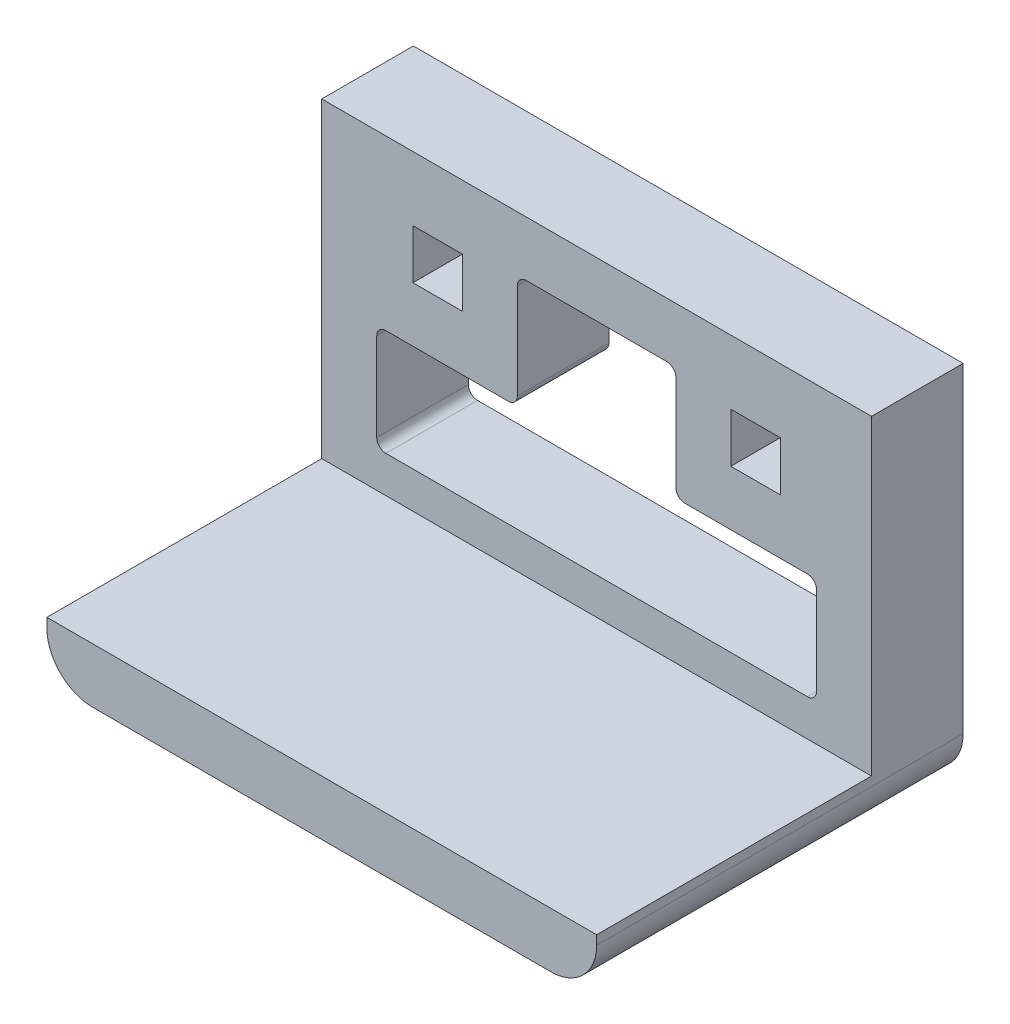
ISO-10303-21;
HEADER;
FILE_DESCRIPTION(('STEP AP214'),'2;1');
FILE_NAME('part.step','',(''),(''),'','','');
FILE_SCHEMA(('AUTOMOTIVE_DESIGN { 1 0 10303 214 1 1 1 1 }'));
ENDSEC;
DATA;
#1=APPLICATION_CONTEXT('core data for automotive mechanical design processes');
#2=APPLICATION_PROTOCOL_DEFINITION('international standard','automotive_design',2000,#1);
#3=PRODUCT_CONTEXT('',#1,'mechanical');
#4=PRODUCT('Part','Part','',(#3));
#5=PRODUCT_RELATED_PRODUCT_CATEGORY('part','',(#4));
#6=PRODUCT_DEFINITION_FORMATION('','',#4);
#7=PRODUCT_DEFINITION_CONTEXT('part definition',#1,'design');
#8=PRODUCT_DEFINITION('design','',#6,#7);
#9=PRODUCT_DEFINITION_SHAPE('','',#8);
#10=(LENGTH_UNIT() NAMED_UNIT(*) SI_UNIT(.MILLI.,.METRE.));
#11=(NAMED_UNIT(*) PLANE_ANGLE_UNIT() SI_UNIT($,.RADIAN.));
#12=(NAMED_UNIT(*) SI_UNIT($,.STERADIAN.) SOLID_ANGLE_UNIT());
#13=UNCERTAINTY_MEASURE_WITH_UNIT(LENGTH_MEASURE(1.E-05),#10,'distance_accuracy_value','');
#14=(GEOMETRIC_REPRESENTATION_CONTEXT(3) GLOBAL_UNCERTAINTY_ASSIGNED_CONTEXT((#13)) GLOBAL_UNIT_ASSIGNED_CONTEXT((#10,
#11,#12)) REPRESENTATION_CONTEXT('',''));
#15=CARTESIAN_POINT('',(0.,0.,0.));
#16=DIRECTION('',(0.,0.,1.));
#17=DIRECTION('',(1.,0.,0.));
#18=AXIS2_PLACEMENT_3D('',#15,#16,#17);
#19=CARTESIAN_POINT('',(0.,0.,10.));
#20=DIRECTION('',(0.,0.,-1.));
#21=DIRECTION('',(-1.,0.,0.));
#22=AXIS2_PLACEMENT_3D('',#19,#20,#21);
#23=PLANE('',#22);
#24=DIRECTION('',(-1.,0.,0.));
#25=VECTOR('',#24,1.);
#26=CARTESIAN_POINT('',(-24.,1.6,10.));
#27=LINE('',#26,#25);
#28=CARTESIAN_POINT('',(-9.65,1.6,10.));
#29=VERTEX_POINT('',#28);
#30=CARTESIAN_POINT('',(-23.,1.6,10.));
#31=VERTEX_POINT('',#30);
#32=EDGE_CURVE('E673',#29,#31,#27,.T.);
#33=ORIENTED_EDGE('',*,*,#32,.F.);
#34=CARTESIAN_POINT('',(-9.65,2.6,10.));
#35=DIRECTION('',(0.,0.,-1.));
#36=DIRECTION('',(-1.,0.,0.));
#37=AXIS2_PLACEMENT_3D('',#34,#35,#36);
#38=CIRCLE('',#37,1.);
#39=CARTESIAN_POINT('',(-8.65,2.6,10.));
#40=VERTEX_POINT('',#39);
#41=EDGE_CURVE('E467',#29,#40,#38,.F.);
#42=ORIENTED_EDGE('',*,*,#41,.T.);
#43=DIRECTION('',(0.,-1.,0.));
#44=VECTOR('',#43,1.);
#45=CARTESIAN_POINT('',(-8.65,14.,10.));
#46=LINE('',#45,#44);
#47=CARTESIAN_POINT('',(-8.65,13.,10.));
#48=VERTEX_POINT('',#47);
#49=EDGE_CURVE('E669',#48,#40,#46,.T.);
#50=ORIENTED_EDGE('',*,*,#49,.F.);
#51=CARTESIAN_POINT('',(-7.65,13.,10.));
#52=DIRECTION('',(0.,0.,-1.));
#53=DIRECTION('',(-1.,0.,0.));
#54=AXIS2_PLACEMENT_3D('',#51,#52,#53);
#55=CIRCLE('',#54,1.);
#56=CARTESIAN_POINT('',(-7.65,14.,10.));
#57=VERTEX_POINT('',#56);
#58=EDGE_CURVE('E506',#48,#57,#55,.T.);
#59=ORIENTED_EDGE('',*,*,#58,.T.);
#60=DIRECTION('',(-1.,0.,0.));
#61=VECTOR('',#60,1.);
#62=CARTESIAN_POINT('',(-8.65,14.,10.));
#63=LINE('',#62,#61);
#64=CARTESIAN_POINT('',(7.65,14.,10.));
#65=VERTEX_POINT('',#64);
#66=EDGE_CURVE('E665',#65,#57,#63,.T.);
#67=ORIENTED_EDGE('',*,*,#66,.F.);
#68=CARTESIAN_POINT('',(7.65,13.,10.));
#69=DIRECTION('',(0.,0.,-1.));
#70=DIRECTION('',(-1.,0.,0.));
#71=AXIS2_PLACEMENT_3D('',#68,#69,#70);
#72=CIRCLE('',#71,1.);
#73=CARTESIAN_POINT('',(8.65,13.,10.));
#74=VERTEX_POINT('',#73);
#75=EDGE_CURVE('E500',#65,#74,#72,.T.);
#76=ORIENTED_EDGE('',*,*,#75,.T.);
#77=DIRECTION('',(0.,1.,0.));
#78=VECTOR('',#77,1.);
#79=CARTESIAN_POINT('',(8.65,14.,10.));
#80=LINE('',#79,#78);
#81=CARTESIAN_POINT('',(8.65,2.6,10.));
#82=VERTEX_POINT('',#81);
#83=EDGE_CURVE('E662',#82,#74,#80,.T.);
#84=ORIENTED_EDGE('',*,*,#83,.F.);
#85=CARTESIAN_POINT('',(9.65,2.6,10.));
#86=DIRECTION('',(0.,0.,-1.));
#87=DIRECTION('',(-1.,0.,0.));
#88=AXIS2_PLACEMENT_3D('',#85,#86,#87);
#89=CIRCLE('',#88,1.);
#90=CARTESIAN_POINT('',(9.65,1.6,10.));
#91=VERTEX_POINT('',#90);
#92=EDGE_CURVE('E464',#82,#91,#89,.F.);
#93=ORIENTED_EDGE('',*,*,#92,.T.);
#94=DIRECTION('',(-1.,0.,0.));
#95=VECTOR('',#94,1.);
#96=CARTESIAN_POINT('',(8.65,1.6,10.));
#97=LINE('',#96,#95);
#98=CARTESIAN_POINT('',(23.,1.6,10.));
#99=VERTEX_POINT('',#98);
#100=EDGE_CURVE('E658',#99,#91,#97,.T.);
#101=ORIENTED_EDGE('',*,*,#100,.F.);
#102=CARTESIAN_POINT('',(23.,0.600000000000002,10.));
#103=DIRECTION('',(0.,0.,-1.));
#104=DIRECTION('',(-1.,0.,0.));
#105=AXIS2_PLACEMENT_3D('',#102,#103,#104);
#106=CIRCLE('',#105,1.);
#107=CARTESIAN_POINT('',(24.,0.600000000000003,10.));
#108=VERTEX_POINT('',#107);
#109=EDGE_CURVE('E494',#99,#108,#106,.T.);
#110=ORIENTED_EDGE('',*,*,#109,.T.);
#111=DIRECTION('',(0.,1.,0.));
#112=VECTOR('',#111,1.);
#113=CARTESIAN_POINT('',(24.,1.6,10.));
#114=LINE('',#113,#112);
#115=CARTESIAN_POINT('',(24.,-9.,10.));
#116=VERTEX_POINT('',#115);
#117=EDGE_CURVE('E654',#116,#108,#114,.T.);
#118=ORIENTED_EDGE('',*,*,#117,.F.);
#119=CARTESIAN_POINT('',(23.,-9.,10.));
#120=DIRECTION('',(0.,0.,-1.));
#121=DIRECTION('',(-1.,0.,0.));
#122=AXIS2_PLACEMENT_3D('',#119,#120,#121);
#123=CIRCLE('',#122,1.);
#124=CARTESIAN_POINT('',(23.,-10.,10.));
#125=VERTEX_POINT('',#124);
#126=EDGE_CURVE('E476',#116,#125,#123,.T.);
#127=ORIENTED_EDGE('',*,*,#126,.T.);
#128=DIRECTION('',(1.,0.,0.));
#129=VECTOR('',#128,1.);
#130=CARTESIAN_POINT('',(-24.,-10.,10.));
#131=LINE('',#130,#129);
#132=CARTESIAN_POINT('',(-23.,-10.,10.));
#133=VERTEX_POINT('',#132);
#134=EDGE_CURVE('E650',#133,#125,#131,.T.);
#135=ORIENTED_EDGE('',*,*,#134,.F.);
#136=CARTESIAN_POINT('',(-23.,-9.,10.));
#137=DIRECTION('',(0.,0.,-1.));
#138=DIRECTION('',(-1.,0.,0.));
#139=AXIS2_PLACEMENT_3D('',#136,#137,#138);
#140=CIRCLE('',#139,1.);
#141=CARTESIAN_POINT('',(-24.,-9.,10.));
#142=VERTEX_POINT('',#141);
#143=EDGE_CURVE('E482',#133,#142,#140,.T.);
#144=ORIENTED_EDGE('',*,*,#143,.T.);
#145=DIRECTION('',(0.,-1.,0.));
#146=VECTOR('',#145,1.);
#147=CARTESIAN_POINT('',(-24.,1.6,10.));
#148=LINE('',#147,#146);
#149=CARTESIAN_POINT('',(-24.,0.600000000000003,10.));
#150=VERTEX_POINT('',#149);
#151=EDGE_CURVE('E646',#150,#142,#148,.T.);
#152=ORIENTED_EDGE('',*,*,#151,.F.);
#153=CARTESIAN_POINT('',(-23.,0.600000000000002,10.));
#154=DIRECTION('',(0.,0.,-1.));
#155=DIRECTION('',(-1.,0.,0.));
#156=AXIS2_PLACEMENT_3D('',#153,#154,#155);
#157=CIRCLE('',#156,1.);
#158=EDGE_CURVE('E488',#150,#31,#157,.T.);
#159=ORIENTED_EDGE('',*,*,#158,.T.);
#160=EDGE_LOOP('',(#33,#42,#50,#59,#67,#76,#84,#93,#101,#110,#118,#127,#135,#144,#152,#159));
#161=FACE_BOUND('',#160,.T.);
#162=DIRECTION('',(-1.,0.,0.));
#163=VECTOR('',#162,1.);
#164=CARTESIAN_POINT('',(20.05,13.,10.));
#165=LINE('',#164,#163);
#166=CARTESIAN_POINT('',(20.05,13.,10.));
#167=VERTEX_POINT('',#166);
#168=CARTESIAN_POINT('',(14.65,13.,10.));
#169=VERTEX_POINT('',#168);
#170=EDGE_CURVE('E358',#167,#169,#165,.T.);
#171=ORIENTED_EDGE('',*,*,#170,.F.);
#172=DIRECTION('',(0.,1.,0.));
#173=VECTOR('',#172,1.);
#174=CARTESIAN_POINT('',(20.05,7.6,10.));
#175=LINE('',#174,#173);
#176=CARTESIAN_POINT('',(20.05,7.6,10.));
#177=VERTEX_POINT('',#176);
#178=EDGE_CURVE('E312',#177,#167,#175,.T.);
#179=ORIENTED_EDGE('',*,*,#178,.F.);
#180=DIRECTION('',(1.,0.,0.));
#181=VECTOR('',#180,1.);
#182=CARTESIAN_POINT('',(20.05,7.6,10.));
#183=LINE('',#182,#181);
#184=CARTESIAN_POINT('',(14.65,7.6,10.));
#185=VERTEX_POINT('',#184);
#186=EDGE_CURVE('E349',#185,#177,#183,.T.);
#187=ORIENTED_EDGE('',*,*,#186,.F.);
#188=DIRECTION('',(0.,-1.,0.));
#189=VECTOR('',#188,1.);
#190=CARTESIAN_POINT('',(14.65,7.6,10.));
#191=LINE('',#190,#189);
#192=EDGE_CURVE('E353',#169,#185,#191,.T.);
#193=ORIENTED_EDGE('',*,*,#192,.F.);
#194=EDGE_LOOP('',(#171,#179,#187,#193));
#195=FACE_BOUND('',#194,.T.);
#196=DIRECTION('',(-1.,0.,0.));
#197=VECTOR('',#196,1.);
#198=CARTESIAN_POINT('',(-20.05,13.,10.));
#199=LINE('',#198,#197);
#200=CARTESIAN_POINT('',(-14.65,13.,10.));
#201=VERTEX_POINT('',#200);
#202=CARTESIAN_POINT('',(-20.05,13.,10.));
#203=VERTEX_POINT('',#202);
#204=EDGE_CURVE('E311',#201,#203,#199,.T.);
#205=ORIENTED_EDGE('',*,*,#204,.F.);
#206=DIRECTION('',(0.,1.,0.));
#207=VECTOR('',#206,1.);
#208=CARTESIAN_POINT('',(-14.65,7.6,10.));
#209=LINE('',#208,#207);
#210=CARTESIAN_POINT('',(-14.65,7.6,10.));
#211=VERTEX_POINT('',#210);
#212=EDGE_CURVE('E308',#211,#201,#209,.T.);
#213=ORIENTED_EDGE('',*,*,#212,.F.);
#214=DIRECTION('',(1.,0.,0.));
#215=VECTOR('',#214,1.);
#216=CARTESIAN_POINT('',(-20.05,7.6,10.));
#217=LINE('',#216,#215);
#218=CARTESIAN_POINT('',(-20.05,7.6,10.));
#219=VERTEX_POINT('',#218);
#220=EDGE_CURVE('E295',#219,#211,#217,.T.);
#221=ORIENTED_EDGE('',*,*,#220,.F.);
#222=DIRECTION('',(0.,-1.,0.));
#223=VECTOR('',#222,1.);
#224=CARTESIAN_POINT('',(-20.05,7.6,10.));
#225=LINE('',#224,#223);
#226=EDGE_CURVE('E316',#203,#219,#225,.T.);
#227=ORIENTED_EDGE('',*,*,#226,.F.);
#228=EDGE_LOOP('',(#205,#213,#221,#227));
#229=FACE_BOUND('',#228,.T.);
#230=DIRECTION('',(-1.,0.,0.));
#231=VECTOR('',#230,1.);
#232=CARTESIAN_POINT('',(-30.,-14.,10.));
#233=LINE('',#232,#231);
#234=CARTESIAN_POINT('',(30.,-14.,10.));
#235=VERTEX_POINT('',#234);
#236=CARTESIAN_POINT('',(-30.,-14.,10.));
#237=VERTEX_POINT('',#236);
#238=EDGE_CURVE('E285',#235,#237,#233,.T.);
#239=ORIENTED_EDGE('',*,*,#238,.F.);
#240=DIRECTION('',(0.,1.,0.));
#241=VECTOR('',#240,1.);
#242=CARTESIAN_POINT('',(30.,-20.,10.));
#243=LINE('',#242,#241);
#244=CARTESIAN_POINT('',(30.,20.,10.));
#245=VERTEX_POINT('',#244);
#246=EDGE_CURVE('E270',#235,#245,#243,.T.);
#247=ORIENTED_EDGE('',*,*,#246,.T.);
#248=DIRECTION('',(-1.,0.,0.));
#249=VECTOR('',#248,1.);
#250=CARTESIAN_POINT('',(30.,20.,10.));
#251=LINE('',#250,#249);
#252=CARTESIAN_POINT('',(-30.,20.,10.));
#253=VERTEX_POINT('',#252);
#254=EDGE_CURVE('E378',#245,#253,#251,.T.);
#255=ORIENTED_EDGE('',*,*,#254,.T.);
#256=DIRECTION('',(0.,-1.,0.));
#257=VECTOR('',#256,1.);
#258=CARTESIAN_POINT('',(-30.,-20.,10.));
#259=LINE('',#258,#257);
#260=EDGE_CURVE('E382',#253,#237,#259,.T.);
#261=ORIENTED_EDGE('',*,*,#260,.T.);
#262=EDGE_LOOP('',(#239,#247,#255,#261));
#263=FACE_BOUND('',#262,.T.);
#264=ADVANCED_FACE('F44',(#161,#195,#229,#263),#23,.F.);
#265=CARTESIAN_POINT('',(30.,20.,10.));
#266=DIRECTION('',(0.,-1.,0.));
#267=DIRECTION('',(1.,0.,0.));
#268=AXIS2_PLACEMENT_3D('',#265,#266,#267);
#269=PLANE('',#268);
#270=DIRECTION('',(-1.,0.,0.));
#271=VECTOR('',#270,1.);
#272=CARTESIAN_POINT('',(30.,20.,0.));
#273=LINE('',#272,#271);
#274=CARTESIAN_POINT('',(30.,20.,0.));
#275=VERTEX_POINT('',#274);
#276=CARTESIAN_POINT('',(-30.,20.,0.));
#277=VERTEX_POINT('',#276);
#278=EDGE_CURVE('E326',#275,#277,#273,.T.);
#279=ORIENTED_EDGE('',*,*,#278,.T.);
#280=DIRECTION('',(0.,0.,-1.));
#281=VECTOR('',#280,1.);
#282=CARTESIAN_POINT('',(-30.,20.,10.));
#283=LINE('',#282,#281);
#284=EDGE_CURVE('E404',#253,#277,#283,.T.);
#285=ORIENTED_EDGE('',*,*,#284,.F.);
#286=ORIENTED_EDGE('',*,*,#254,.F.);
#287=DIRECTION('',(0.,0.,-1.));
#288=VECTOR('',#287,1.);
#289=CARTESIAN_POINT('',(30.,20.,10.));
#290=LINE('',#289,#288);
#291=EDGE_CURVE('E388',#245,#275,#290,.T.);
#292=ORIENTED_EDGE('',*,*,#291,.T.);
#293=EDGE_LOOP('',(#279,#285,#286,#292));
#294=FACE_BOUND('',#293,.T.);
#295=ADVANCED_FACE('F546',(#294),#269,.F.);
#296=CARTESIAN_POINT('',(-30.,-20.,10.));
#297=DIRECTION('',(1.,0.,0.));
#298=DIRECTION('',(0.,0.,-1.));
#299=AXIS2_PLACEMENT_3D('',#296,#297,#298);
#300=PLANE('',#299);
#301=DIRECTION('',(0.,-1.,0.));
#302=VECTOR('',#301,1.);
#303=CARTESIAN_POINT('',(-30.,-20.,0.));
#304=LINE('',#303,#302);
#305=CARTESIAN_POINT('',(-30.,-15.,0.));
#306=VERTEX_POINT('',#305);
#307=EDGE_CURVE('E392',#277,#306,#304,.T.);
#308=ORIENTED_EDGE('',*,*,#307,.T.);
#309=DIRECTION('',(0.,0.,-1.));
#310=VECTOR('',#309,1.);
#311=CARTESIAN_POINT('',(-30.,-15.,10.));
#312=LINE('',#311,#310);
#313=CARTESIAN_POINT('',(-30.,-15.,40.));
#314=VERTEX_POINT('',#313);
#315=EDGE_CURVE('E68',#306,#314,#312,.F.);
#316=ORIENTED_EDGE('',*,*,#315,.T.);
#317=DIRECTION('',(0.,-1.,0.));
#318=VECTOR('',#317,1.);
#319=CARTESIAN_POINT('',(-30.,-20.,40.));
#320=LINE('',#319,#318);
#321=CARTESIAN_POINT('',(-30.,-14.,40.));
#322=VERTEX_POINT('',#321);
#323=EDGE_CURVE('E287',#322,#314,#320,.T.);
#324=ORIENTED_EDGE('',*,*,#323,.F.);
#325=DIRECTION('',(0.,0.,-1.));
#326=VECTOR('',#325,1.);
#327=CARTESIAN_POINT('',(-30.,-14.,40.));
#328=LINE('',#327,#326);
#329=EDGE_CURVE('E275',#322,#237,#328,.T.);
#330=ORIENTED_EDGE('',*,*,#329,.T.);
#331=ORIENTED_EDGE('',*,*,#260,.F.);
#332=ORIENTED_EDGE('',*,*,#284,.T.);
#333=EDGE_LOOP('',(#308,#316,#324,#330,#331,#332));
#334=FACE_BOUND('',#333,.T.);
#335=ADVANCED_FACE('F542',(#334),#300,.F.);
#336=CARTESIAN_POINT('',(30.,-20.,10.));
#337=DIRECTION('',(0.,1.,0.));
#338=DIRECTION('',(-1.,0.,0.));
#339=AXIS2_PLACEMENT_3D('',#336,#337,#338);
#340=PLANE('',#339);
#341=DIRECTION('',(1.,0.,0.));
#342=VECTOR('',#341,1.);
#343=CARTESIAN_POINT('',(-30.,-20.,40.));
#344=LINE('',#343,#342);
#345=CARTESIAN_POINT('',(-25.,-20.,40.));
#346=VERTEX_POINT('',#345);
#347=CARTESIAN_POINT('',(25.,-20.,40.));
#348=VERTEX_POINT('',#347);
#349=EDGE_CURVE('E263',#346,#348,#344,.T.);
#350=ORIENTED_EDGE('',*,*,#349,.F.);
#351=DIRECTION('',(0.,0.,-1.));
#352=VECTOR('',#351,1.);
#353=CARTESIAN_POINT('',(-25.,-20.,10.));
#354=LINE('',#353,#352);
#355=CARTESIAN_POINT('',(-25.,-20.,0.));
#356=VERTEX_POINT('',#355);
#357=EDGE_CURVE('E515',#346,#356,#354,.T.);
#358=ORIENTED_EDGE('',*,*,#357,.T.);
#359=DIRECTION('',(1.,0.,0.));
#360=VECTOR('',#359,1.);
#361=CARTESIAN_POINT('',(30.,-20.,0.));
#362=LINE('',#361,#360);
#363=CARTESIAN_POINT('',(25.,-20.,0.));
#364=VERTEX_POINT('',#363);
#365=EDGE_CURVE('E395',#356,#364,#362,.T.);
#366=ORIENTED_EDGE('',*,*,#365,.T.);
#367=DIRECTION('',(0.,0.,-1.));
#368=VECTOR('',#367,1.);
#369=CARTESIAN_POINT('',(25.,-20.,10.));
#370=LINE('',#369,#368);
#371=EDGE_CURVE('E512',#364,#348,#370,.F.);
#372=ORIENTED_EDGE('',*,*,#371,.T.);
#373=EDGE_LOOP('',(#350,#358,#366,#372));
#374=FACE_BOUND('',#373,.T.);
#375=ADVANCED_FACE('F534',(#374),#340,.F.);
#376=CARTESIAN_POINT('',(30.,-20.,10.));
#377=DIRECTION('',(-1.,0.,0.));
#378=DIRECTION('',(0.,-1.,0.));
#379=AXIS2_PLACEMENT_3D('',#376,#377,#378);
#380=PLANE('',#379);
#381=DIRECTION('',(0.,1.,0.));
#382=VECTOR('',#381,1.);
#383=CARTESIAN_POINT('',(30.,-20.,40.));
#384=LINE('',#383,#382);
#385=CARTESIAN_POINT('',(30.,-15.,40.));
#386=VERTEX_POINT('',#385);
#387=CARTESIAN_POINT('',(30.,-14.,40.));
#388=VERTEX_POINT('',#387);
#389=EDGE_CURVE('E254',#386,#388,#384,.T.);
#390=ORIENTED_EDGE('',*,*,#389,.F.);
#391=DIRECTION('',(0.,0.,-1.));
#392=VECTOR('',#391,1.);
#393=CARTESIAN_POINT('',(30.,-15.,10.));
#394=LINE('',#393,#392);
#395=CARTESIAN_POINT('',(30.,-15.,0.));
#396=VERTEX_POINT('',#395);
#397=EDGE_CURVE('E11',#386,#396,#394,.T.);
#398=ORIENTED_EDGE('',*,*,#397,.T.);
#399=DIRECTION('',(0.,1.,0.));
#400=VECTOR('',#399,1.);
#401=CARTESIAN_POINT('',(30.,-20.,0.));
#402=LINE('',#401,#400);
#403=EDGE_CURVE('E383',#396,#275,#402,.T.);
#404=ORIENTED_EDGE('',*,*,#403,.T.);
#405=ORIENTED_EDGE('',*,*,#291,.F.);
#406=ORIENTED_EDGE('',*,*,#246,.F.);
#407=DIRECTION('',(0.,0.,-1.));
#408=VECTOR('',#407,1.);
#409=CARTESIAN_POINT('',(30.,-14.,40.));
#410=LINE('',#409,#408);
#411=EDGE_CURVE('E267',#388,#235,#410,.T.);
#412=ORIENTED_EDGE('',*,*,#411,.F.);
#413=EDGE_LOOP('',(#390,#398,#404,#405,#406,#412));
#414=FACE_BOUND('',#413,.T.);
#415=ADVANCED_FACE('F268',(#414),#380,.F.);
#416=CARTESIAN_POINT('',(0.,0.,0.));
#417=DIRECTION('',(0.,0.,-1.));
#418=DIRECTION('',(-1.,0.,0.));
#419=AXIS2_PLACEMENT_3D('',#416,#417,#418);
#420=PLANE('',#419);
#421=DIRECTION('',(0.,-1.,0.));
#422=VECTOR('',#421,1.);
#423=CARTESIAN_POINT('',(-8.65,14.,0.));
#424=LINE('',#423,#422);
#425=CARTESIAN_POINT('',(-8.65,13.,0.));
#426=VERTEX_POINT('',#425);
#427=CARTESIAN_POINT('',(-8.65,2.6,0.));
#428=VERTEX_POINT('',#427);
#429=EDGE_CURVE('E635',#426,#428,#424,.T.);
#430=ORIENTED_EDGE('',*,*,#429,.T.);
#431=CARTESIAN_POINT('',(-9.65,2.6,0.));
#432=DIRECTION('',(0.,0.,-1.));
#433=DIRECTION('',(-1.,0.,0.));
#434=AXIS2_PLACEMENT_3D('',#431,#432,#433);
#435=CIRCLE('',#434,1.);
#436=CARTESIAN_POINT('',(-9.65,1.6,0.));
#437=VERTEX_POINT('',#436);
#438=EDGE_CURVE('E473',#428,#437,#435,.T.);
#439=ORIENTED_EDGE('',*,*,#438,.T.);
#440=DIRECTION('',(-1.,0.,0.));
#441=VECTOR('',#440,1.);
#442=CARTESIAN_POINT('',(-24.,1.6,0.));
#443=LINE('',#442,#441);
#444=CARTESIAN_POINT('',(-23.,1.6,0.));
#445=VERTEX_POINT('',#444);
#446=EDGE_CURVE('E288',#437,#445,#443,.T.);
#447=ORIENTED_EDGE('',*,*,#446,.T.);
#448=CARTESIAN_POINT('',(-23.,0.600000000000002,0.));
#449=DIRECTION('',(0.,0.,-1.));
#450=DIRECTION('',(-1.,0.,0.));
#451=AXIS2_PLACEMENT_3D('',#448,#449,#450);
#452=CIRCLE('',#451,1.);
#453=CARTESIAN_POINT('',(-24.,0.600000000000003,0.));
#454=VERTEX_POINT('',#453);
#455=EDGE_CURVE('E491',#445,#454,#452,.F.);
#456=ORIENTED_EDGE('',*,*,#455,.T.);
#457=DIRECTION('',(0.,-1.,0.));
#458=VECTOR('',#457,1.);
#459=CARTESIAN_POINT('',(-24.,1.6,0.));
#460=LINE('',#459,#458);
#461=CARTESIAN_POINT('',(-24.,-9.,0.));
#462=VERTEX_POINT('',#461);
#463=EDGE_CURVE('E677',#454,#462,#460,.T.);
#464=ORIENTED_EDGE('',*,*,#463,.T.);
#465=CARTESIAN_POINT('',(-23.,-9.,0.));
#466=DIRECTION('',(0.,0.,-1.));
#467=DIRECTION('',(-1.,0.,0.));
#468=AXIS2_PLACEMENT_3D('',#465,#466,#467);
#469=CIRCLE('',#468,1.);
#470=CARTESIAN_POINT('',(-23.,-10.,0.));
#471=VERTEX_POINT('',#470);
#472=EDGE_CURVE('E485',#462,#471,#469,.F.);
#473=ORIENTED_EDGE('',*,*,#472,.T.);
#474=DIRECTION('',(1.,0.,0.));
#475=VECTOR('',#474,1.);
#476=CARTESIAN_POINT('',(-24.,-10.,0.));
#477=LINE('',#476,#475);
#478=CARTESIAN_POINT('',(23.,-10.,0.));
#479=VERTEX_POINT('',#478);
#480=EDGE_CURVE('E683',#471,#479,#477,.T.);
#481=ORIENTED_EDGE('',*,*,#480,.T.);
#482=CARTESIAN_POINT('',(23.,-9.,0.));
#483=DIRECTION('',(0.,0.,-1.));
#484=DIRECTION('',(-1.,0.,0.));
#485=AXIS2_PLACEMENT_3D('',#482,#483,#484);
#486=CIRCLE('',#485,1.);
#487=CARTESIAN_POINT('',(24.,-9.,0.));
#488=VERTEX_POINT('',#487);
#489=EDGE_CURVE('E479',#479,#488,#486,.F.);
#490=ORIENTED_EDGE('',*,*,#489,.T.);
#491=DIRECTION('',(0.,1.,0.));
#492=VECTOR('',#491,1.);
#493=CARTESIAN_POINT('',(24.,1.6,0.));
#494=LINE('',#493,#492);
#495=CARTESIAN_POINT('',(24.,0.600000000000003,0.));
#496=VERTEX_POINT('',#495);
#497=EDGE_CURVE('E637',#488,#496,#494,.T.);
#498=ORIENTED_EDGE('',*,*,#497,.T.);
#499=CARTESIAN_POINT('',(23.,0.600000000000002,0.));
#500=DIRECTION('',(0.,0.,-1.));
#501=DIRECTION('',(-1.,0.,0.));
#502=AXIS2_PLACEMENT_3D('',#499,#500,#501);
#503=CIRCLE('',#502,1.);
#504=CARTESIAN_POINT('',(23.,1.6,0.));
#505=VERTEX_POINT('',#504);
#506=EDGE_CURVE('E497',#496,#505,#503,.F.);
#507=ORIENTED_EDGE('',*,*,#506,.T.);
#508=DIRECTION('',(-1.,0.,0.));
#509=VECTOR('',#508,1.);
#510=CARTESIAN_POINT('',(8.65,1.6,0.));
#511=LINE('',#510,#509);
#512=CARTESIAN_POINT('',(9.65,1.6,0.));
#513=VERTEX_POINT('',#512);
#514=EDGE_CURVE('E623',#505,#513,#511,.T.);
#515=ORIENTED_EDGE('',*,*,#514,.T.);
#516=CARTESIAN_POINT('',(9.65,2.6,0.));
#517=DIRECTION('',(0.,0.,-1.));
#518=DIRECTION('',(-1.,0.,0.));
#519=AXIS2_PLACEMENT_3D('',#516,#517,#518);
#520=CIRCLE('',#519,1.);
#521=CARTESIAN_POINT('',(8.65,2.6,0.));
#522=VERTEX_POINT('',#521);
#523=EDGE_CURVE('E470',#513,#522,#520,.T.);
#524=ORIENTED_EDGE('',*,*,#523,.T.);
#525=DIRECTION('',(0.,1.,0.));
#526=VECTOR('',#525,1.);
#527=CARTESIAN_POINT('',(8.65,14.,0.));
#528=LINE('',#527,#526);
#529=CARTESIAN_POINT('',(8.65,13.,0.));
#530=VERTEX_POINT('',#529);
#531=EDGE_CURVE('E620',#522,#530,#528,.T.);
#532=ORIENTED_EDGE('',*,*,#531,.T.);
#533=CARTESIAN_POINT('',(7.65,13.,0.));
#534=DIRECTION('',(0.,0.,-1.));
#535=DIRECTION('',(-1.,0.,0.));
#536=AXIS2_PLACEMENT_3D('',#533,#534,#535);
#537=CIRCLE('',#536,1.);
#538=CARTESIAN_POINT('',(7.65,14.,0.));
#539=VERTEX_POINT('',#538);
#540=EDGE_CURVE('E503',#530,#539,#537,.F.);
#541=ORIENTED_EDGE('',*,*,#540,.T.);
#542=DIRECTION('',(-1.,0.,0.));
#543=VECTOR('',#542,1.);
#544=CARTESIAN_POINT('',(-8.65,14.,0.));
#545=LINE('',#544,#543);
#546=CARTESIAN_POINT('',(-7.65,14.,0.));
#547=VERTEX_POINT('',#546);
#548=EDGE_CURVE('E630',#539,#547,#545,.T.);
#549=ORIENTED_EDGE('',*,*,#548,.T.);
#550=CARTESIAN_POINT('',(-7.65,13.,0.));
#551=DIRECTION('',(0.,0.,-1.));
#552=DIRECTION('',(-1.,0.,0.));
#553=AXIS2_PLACEMENT_3D('',#550,#551,#552);
#554=CIRCLE('',#553,1.);
#555=EDGE_CURVE('E509',#547,#426,#554,.F.);
#556=ORIENTED_EDGE('',*,*,#555,.T.);
#557=EDGE_LOOP('',(#430,#439,#447,#456,#464,#473,#481,#490,#498,#507,#515,#524,#532,#541,#549,#556));
#558=FACE_BOUND('',#557,.T.);
#559=DIRECTION('',(0.,1.,0.));
#560=VECTOR('',#559,1.);
#561=CARTESIAN_POINT('',(-14.65,7.6,0.));
#562=LINE('',#561,#560);
#563=CARTESIAN_POINT('',(-14.65,7.6,0.));
#564=VERTEX_POINT('',#563);
#565=CARTESIAN_POINT('',(-14.65,13.,0.));
#566=VERTEX_POINT('',#565);
#567=EDGE_CURVE('E290',#564,#566,#562,.T.);
#568=ORIENTED_EDGE('',*,*,#567,.T.);
#569=DIRECTION('',(-1.,0.,0.));
#570=VECTOR('',#569,1.);
#571=CARTESIAN_POINT('',(-20.05,13.,0.));
#572=LINE('',#571,#570);
#573=CARTESIAN_POINT('',(-20.05,13.,0.));
#574=VERTEX_POINT('',#573);
#575=EDGE_CURVE('E294',#566,#574,#572,.T.);
#576=ORIENTED_EDGE('',*,*,#575,.T.);
#577=DIRECTION('',(0.,-1.,0.));
#578=VECTOR('',#577,1.);
#579=CARTESIAN_POINT('',(-20.05,7.6,0.));
#580=LINE('',#579,#578);
#581=CARTESIAN_POINT('',(-20.05,7.6,0.));
#582=VERTEX_POINT('',#581);
#583=EDGE_CURVE('E299',#574,#582,#580,.T.);
#584=ORIENTED_EDGE('',*,*,#583,.T.);
#585=DIRECTION('',(1.,0.,0.));
#586=VECTOR('',#585,1.);
#587=CARTESIAN_POINT('',(-20.05,7.6,0.));
#588=LINE('',#587,#586);
#589=EDGE_CURVE('E303',#582,#564,#588,.T.);
#590=ORIENTED_EDGE('',*,*,#589,.T.);
#591=EDGE_LOOP('',(#568,#576,#584,#590));
#592=FACE_BOUND('',#591,.T.);
#593=DIRECTION('',(0.,1.,0.));
#594=VECTOR('',#593,1.);
#595=CARTESIAN_POINT('',(20.05,7.6,0.));
#596=LINE('',#595,#594);
#597=CARTESIAN_POINT('',(20.05,7.6,0.));
#598=VERTEX_POINT('',#597);
#599=CARTESIAN_POINT('',(20.05,13.,0.));
#600=VERTEX_POINT('',#599);
#601=EDGE_CURVE('E354',#598,#600,#596,.T.);
#602=ORIENTED_EDGE('',*,*,#601,.T.);
#603=DIRECTION('',(-1.,0.,0.));
#604=VECTOR('',#603,1.);
#605=CARTESIAN_POINT('',(20.05,13.,0.));
#606=LINE('',#605,#604);
#607=CARTESIAN_POINT('',(14.65,13.,0.));
#608=VERTEX_POINT('',#607);
#609=EDGE_CURVE('E371',#600,#608,#606,.T.);
#610=ORIENTED_EDGE('',*,*,#609,.T.);
#611=DIRECTION('',(0.,-1.,0.));
#612=VECTOR('',#611,1.);
#613=CARTESIAN_POINT('',(14.65,7.6,0.));
#614=LINE('',#613,#612);
#615=CARTESIAN_POINT('',(14.65,7.6,0.));
#616=VERTEX_POINT('',#615);
#617=EDGE_CURVE('E367',#608,#616,#614,.T.);
#618=ORIENTED_EDGE('',*,*,#617,.T.);
#619=DIRECTION('',(1.,0.,0.));
#620=VECTOR('',#619,1.);
#621=CARTESIAN_POINT('',(20.05,7.6,0.));
#622=LINE('',#621,#620);
#623=EDGE_CURVE('E340',#616,#598,#622,.T.);
#624=ORIENTED_EDGE('',*,*,#623,.T.);
#625=EDGE_LOOP('',(#602,#610,#618,#624));
#626=FACE_BOUND('',#625,.T.);
#627=ORIENTED_EDGE('',*,*,#365,.F.);
#628=CARTESIAN_POINT('',(-25.,-15.,0.));
#629=DIRECTION('',(0.,0.,-1.));
#630=DIRECTION('',(-1.,0.,0.));
#631=AXIS2_PLACEMENT_3D('',#628,#629,#630);
#632=CIRCLE('',#631,5.);
#633=EDGE_CURVE('E522',#356,#306,#632,.T.);
#634=ORIENTED_EDGE('',*,*,#633,.T.);
#635=ORIENTED_EDGE('',*,*,#307,.F.);
#636=ORIENTED_EDGE('',*,*,#278,.F.);
#637=ORIENTED_EDGE('',*,*,#403,.F.);
#638=CARTESIAN_POINT('',(25.,-15.,0.));
#639=DIRECTION('',(0.,0.,-1.));
#640=DIRECTION('',(-1.,0.,0.));
#641=AXIS2_PLACEMENT_3D('',#638,#639,#640);
#642=CIRCLE('',#641,5.);
#643=EDGE_CURVE('E519',#396,#364,#642,.T.);
#644=ORIENTED_EDGE('',*,*,#643,.T.);
#645=EDGE_LOOP('',(#627,#634,#635,#636,#637,#644));
#646=FACE_BOUND('',#645,.T.);
#647=ADVANCED_FACE('F540',(#558,#592,#626,#646),#420,.T.);
#648=CARTESIAN_POINT('',(20.05,7.6,0.));
#649=DIRECTION('',(1.,0.,0.));
#650=DIRECTION('',(0.,0.,-1.));
#651=AXIS2_PLACEMENT_3D('',#648,#649,#650);
#652=PLANE('',#651);
#653=ORIENTED_EDGE('',*,*,#178,.T.);
#654=DIRECTION('',(0.,0.,1.));
#655=VECTOR('',#654,1.);
#656=CARTESIAN_POINT('',(20.05,13.,0.));
#657=LINE('',#656,#655);
#658=EDGE_CURVE('E336',#600,#167,#657,.T.);
#659=ORIENTED_EDGE('',*,*,#658,.F.);
#660=ORIENTED_EDGE('',*,*,#601,.F.);
#661=DIRECTION('',(0.,0.,1.));
#662=VECTOR('',#661,1.);
#663=CARTESIAN_POINT('',(20.05,7.6,0.));
#664=LINE('',#663,#662);
#665=EDGE_CURVE('E274',#598,#177,#664,.T.);
#666=ORIENTED_EDGE('',*,*,#665,.T.);
#667=EDGE_LOOP('',(#653,#659,#660,#666));
#668=FACE_BOUND('',#667,.T.);
#669=ADVANCED_FACE('F571',(#668),#652,.F.);
#670=CARTESIAN_POINT('',(20.05,7.6,0.));
#671=DIRECTION('',(0.,-1.,0.));
#672=DIRECTION('',(1.,0.,0.));
#673=AXIS2_PLACEMENT_3D('',#670,#671,#672);
#674=PLANE('',#673);
#675=ORIENTED_EDGE('',*,*,#186,.T.);
#676=ORIENTED_EDGE('',*,*,#665,.F.);
#677=ORIENTED_EDGE('',*,*,#623,.F.);
#678=DIRECTION('',(0.,0.,1.));
#679=VECTOR('',#678,1.);
#680=CARTESIAN_POINT('',(14.65,7.6,0.));
#681=LINE('',#680,#679);
#682=EDGE_CURVE('E344',#616,#185,#681,.T.);
#683=ORIENTED_EDGE('',*,*,#682,.T.);
#684=EDGE_LOOP('',(#675,#676,#677,#683));
#685=FACE_BOUND('',#684,.T.);
#686=ADVANCED_FACE('F567',(#685),#674,.F.);
#687=CARTESIAN_POINT('',(14.65,7.6,0.));
#688=DIRECTION('',(-1.,0.,0.));
#689=DIRECTION('',(0.,-1.,0.));
#690=AXIS2_PLACEMENT_3D('',#687,#688,#689);
#691=PLANE('',#690);
#692=ORIENTED_EDGE('',*,*,#192,.T.);
#693=ORIENTED_EDGE('',*,*,#682,.F.);
#694=ORIENTED_EDGE('',*,*,#617,.F.);
#695=DIRECTION('',(0.,0.,1.));
#696=VECTOR('',#695,1.);
#697=CARTESIAN_POINT('',(14.65,13.,0.));
#698=LINE('',#697,#696);
#699=EDGE_CURVE('E341',#608,#169,#698,.T.);
#700=ORIENTED_EDGE('',*,*,#699,.T.);
#701=EDGE_LOOP('',(#692,#693,#694,#700));
#702=FACE_BOUND('',#701,.T.);
#703=ADVANCED_FACE('F767',(#702),#691,.F.);
#704=CARTESIAN_POINT('',(20.05,13.,0.));
#705=DIRECTION('',(0.,1.,0.));
#706=DIRECTION('',(0.,0.,1.));
#707=AXIS2_PLACEMENT_3D('',#704,#705,#706);
#708=PLANE('',#707);
#709=ORIENTED_EDGE('',*,*,#170,.T.);
#710=ORIENTED_EDGE('',*,*,#699,.F.);
#711=ORIENTED_EDGE('',*,*,#609,.F.);
#712=ORIENTED_EDGE('',*,*,#658,.T.);
#713=EDGE_LOOP('',(#709,#710,#711,#712));
#714=FACE_BOUND('',#713,.T.);
#715=ADVANCED_FACE('F761',(#714),#708,.F.);
#716=CARTESIAN_POINT('',(-14.65,7.6,0.));
#717=DIRECTION('',(1.,0.,0.));
#718=DIRECTION('',(0.,1.,0.));
#719=AXIS2_PLACEMENT_3D('',#716,#717,#718);
#720=PLANE('',#719);
#721=ORIENTED_EDGE('',*,*,#212,.T.);
#722=DIRECTION('',(0.,0.,1.));
#723=VECTOR('',#722,1.);
#724=CARTESIAN_POINT('',(-14.65,13.,0.));
#725=LINE('',#724,#723);
#726=EDGE_CURVE('E307',#566,#201,#725,.T.);
#727=ORIENTED_EDGE('',*,*,#726,.F.);
#728=ORIENTED_EDGE('',*,*,#567,.F.);
#729=DIRECTION('',(0.,0.,1.));
#730=VECTOR('',#729,1.);
#731=CARTESIAN_POINT('',(-14.65,7.6,0.));
#732=LINE('',#731,#730);
#733=EDGE_CURVE('E323',#564,#211,#732,.T.);
#734=ORIENTED_EDGE('',*,*,#733,.T.);
#735=EDGE_LOOP('',(#721,#727,#728,#734));
#736=FACE_BOUND('',#735,.T.);
#737=ADVANCED_FACE('F751',(#736),#720,.F.);
#738=CARTESIAN_POINT('',(-20.05,7.6,0.));
#739=DIRECTION('',(0.,-1.,0.));
#740=DIRECTION('',(1.,0.,0.));
#741=AXIS2_PLACEMENT_3D('',#738,#739,#740);
#742=PLANE('',#741);
#743=ORIENTED_EDGE('',*,*,#220,.T.);
#744=ORIENTED_EDGE('',*,*,#733,.F.);
#745=ORIENTED_EDGE('',*,*,#589,.F.);
#746=DIRECTION('',(0.,0.,1.));
#747=VECTOR('',#746,1.);
#748=CARTESIAN_POINT('',(-20.05,7.6,0.));
#749=LINE('',#748,#747);
#750=EDGE_CURVE('E327',#582,#219,#749,.T.);
#751=ORIENTED_EDGE('',*,*,#750,.T.);
#752=EDGE_LOOP('',(#743,#744,#745,#751));
#753=FACE_BOUND('',#752,.T.);
#754=ADVANCED_FACE('F747',(#753),#742,.F.);
#755=CARTESIAN_POINT('',(-20.05,7.6,0.));
#756=DIRECTION('',(-1.,0.,0.));
#757=DIRECTION('',(0.,0.,1.));
#758=AXIS2_PLACEMENT_3D('',#755,#756,#757);
#759=PLANE('',#758);
#760=ORIENTED_EDGE('',*,*,#226,.T.);
#761=ORIENTED_EDGE('',*,*,#750,.F.);
#762=ORIENTED_EDGE('',*,*,#583,.F.);
#763=DIRECTION('',(0.,0.,1.));
#764=VECTOR('',#763,1.);
#765=CARTESIAN_POINT('',(-20.05,13.,0.));
#766=LINE('',#765,#764);
#767=EDGE_CURVE('E330',#574,#203,#766,.T.);
#768=ORIENTED_EDGE('',*,*,#767,.T.);
#769=EDGE_LOOP('',(#760,#761,#762,#768));
#770=FACE_BOUND('',#769,.T.);
#771=ADVANCED_FACE('F750',(#770),#759,.F.);
#772=CARTESIAN_POINT('',(-20.05,13.,0.));
#773=DIRECTION('',(0.,1.,0.));
#774=DIRECTION('',(0.,0.,1.));
#775=AXIS2_PLACEMENT_3D('',#772,#773,#774);
#776=PLANE('',#775);
#777=ORIENTED_EDGE('',*,*,#204,.T.);
#778=ORIENTED_EDGE('',*,*,#767,.F.);
#779=ORIENTED_EDGE('',*,*,#575,.F.);
#780=ORIENTED_EDGE('',*,*,#726,.T.);
#781=EDGE_LOOP('',(#777,#778,#779,#780));
#782=FACE_BOUND('',#781,.T.);
#783=ADVANCED_FACE('F746',(#782),#776,.F.);
#784=CARTESIAN_POINT('',(-30.,-14.,40.));
#785=DIRECTION('',(0.,-1.,0.));
#786=DIRECTION('',(0.,0.,-1.));
#787=AXIS2_PLACEMENT_3D('',#784,#785,#786);
#788=PLANE('',#787);
#789=ORIENTED_EDGE('',*,*,#238,.T.);
#790=ORIENTED_EDGE('',*,*,#329,.F.);
#791=DIRECTION('',(-1.,0.,0.));
#792=VECTOR('',#791,1.);
#793=CARTESIAN_POINT('',(-30.,-14.,40.));
#794=LINE('',#793,#792);
#795=EDGE_CURVE('E258',#388,#322,#794,.T.);
#796=ORIENTED_EDGE('',*,*,#795,.F.);
#797=ORIENTED_EDGE('',*,*,#411,.T.);
#798=EDGE_LOOP('',(#789,#790,#796,#797));
#799=FACE_BOUND('',#798,.T.);
#800=ADVANCED_FACE('F277',(#799),#788,.F.);
#801=CARTESIAN_POINT('',(0.,0.,40.));
#802=DIRECTION('',(0.,0.,-1.));
#803=DIRECTION('',(-1.,0.,0.));
#804=AXIS2_PLACEMENT_3D('',#801,#802,#803);
#805=PLANE('',#804);
#806=ORIENTED_EDGE('',*,*,#323,.T.);
#807=CARTESIAN_POINT('',(-25.,-15.,40.));
#808=DIRECTION('',(0.,0.,-1.));
#809=DIRECTION('',(-1.,0.,0.));
#810=AXIS2_PLACEMENT_3D('',#807,#808,#809);
#811=CIRCLE('',#810,5.);
#812=EDGE_CURVE('E53',#314,#346,#811,.F.);
#813=ORIENTED_EDGE('',*,*,#812,.T.);
#814=ORIENTED_EDGE('',*,*,#349,.T.);
#815=CARTESIAN_POINT('',(25.,-15.,40.));
#816=DIRECTION('',(0.,0.,-1.));
#817=DIRECTION('',(-1.,0.,0.));
#818=AXIS2_PLACEMENT_3D('',#815,#816,#817);
#819=CIRCLE('',#818,5.);
#820=EDGE_CURVE('E60',#348,#386,#819,.F.);
#821=ORIENTED_EDGE('',*,*,#820,.T.);
#822=ORIENTED_EDGE('',*,*,#389,.T.);
#823=ORIENTED_EDGE('',*,*,#795,.T.);
#824=EDGE_LOOP('',(#806,#813,#814,#821,#822,#823));
#825=FACE_BOUND('',#824,.T.);
#826=ADVANCED_FACE('F256',(#825),#805,.F.);
#827=CARTESIAN_POINT('',(-24.,1.6,0.));
#828=DIRECTION('',(-1.,0.,0.));
#829=DIRECTION('',(0.,0.,1.));
#830=AXIS2_PLACEMENT_3D('',#827,#828,#829);
#831=PLANE('',#830);
#832=ORIENTED_EDGE('',*,*,#151,.T.);
#833=DIRECTION('',(0.,0.,1.));
#834=VECTOR('',#833,1.);
#835=CARTESIAN_POINT('',(-24.,-9.,0.));
#836=LINE('',#835,#834);
#837=EDGE_CURVE('E426',#142,#462,#836,.F.);
#838=ORIENTED_EDGE('',*,*,#837,.T.);
#839=ORIENTED_EDGE('',*,*,#463,.F.);
#840=DIRECTION('',(0.,0.,1.));
#841=VECTOR('',#840,1.);
#842=CARTESIAN_POINT('',(-24.,0.600000000000002,10.));
#843=LINE('',#842,#841);
#844=EDGE_CURVE('E422',#454,#150,#843,.T.);
#845=ORIENTED_EDGE('',*,*,#844,.T.);
#846=EDGE_LOOP('',(#832,#838,#839,#845));
#847=FACE_BOUND('',#846,.T.);
#848=ADVANCED_FACE('F723',(#847),#831,.F.);
#849=CARTESIAN_POINT('',(-24.,1.6,0.));
#850=DIRECTION('',(0.,1.,0.));
#851=DIRECTION('',(0.,0.,1.));
#852=AXIS2_PLACEMENT_3D('',#849,#850,#851);
#853=PLANE('',#852);
#854=ORIENTED_EDGE('',*,*,#32,.T.);
#855=DIRECTION('',(0.,0.,1.));
#856=VECTOR('',#855,1.);
#857=CARTESIAN_POINT('',(-23.,1.6,0.));
#858=LINE('',#857,#856);
#859=EDGE_CURVE('E433',#31,#445,#858,.F.);
#860=ORIENTED_EDGE('',*,*,#859,.T.);
#861=ORIENTED_EDGE('',*,*,#446,.F.);
#862=DIRECTION('',(0.,0.,1.));
#863=VECTOR('',#862,1.);
#864=CARTESIAN_POINT('',(-9.65,1.6,0.));
#865=LINE('',#864,#863);
#866=EDGE_CURVE('E429',#437,#29,#865,.T.);
#867=ORIENTED_EDGE('',*,*,#866,.T.);
#868=EDGE_LOOP('',(#854,#860,#861,#867));
#869=FACE_BOUND('',#868,.T.);
#870=ADVANCED_FACE('F720',(#869),#853,.F.);
#871=CARTESIAN_POINT('',(-8.65,14.,0.));
#872=DIRECTION('',(-1.,0.,0.));
#873=DIRECTION('',(0.,-1.,0.));
#874=AXIS2_PLACEMENT_3D('',#871,#872,#873);
#875=PLANE('',#874);
#876=ORIENTED_EDGE('',*,*,#429,.F.);
#877=DIRECTION('',(0.,0.,1.));
#878=VECTOR('',#877,1.);
#879=CARTESIAN_POINT('',(-8.65,13.,10.));
#880=LINE('',#879,#878);
#881=EDGE_CURVE('E460',#426,#48,#880,.T.);
#882=ORIENTED_EDGE('',*,*,#881,.T.);
#883=ORIENTED_EDGE('',*,*,#49,.T.);
#884=DIRECTION('',(0.,0.,1.));
#885=VECTOR('',#884,1.);
#886=CARTESIAN_POINT('',(-8.65,2.6,0.));
#887=LINE('',#886,#885);
#888=EDGE_CURVE('E457',#40,#428,#887,.F.);
#889=ORIENTED_EDGE('',*,*,#888,.T.);
#890=EDGE_LOOP('',(#876,#882,#883,#889));
#891=FACE_BOUND('',#890,.T.);
#892=ADVANCED_FACE('F714',(#891),#875,.F.);
#893=CARTESIAN_POINT('',(-8.65,14.,0.));
#894=DIRECTION('',(0.,1.,0.));
#895=DIRECTION('',(0.,0.,1.));
#896=AXIS2_PLACEMENT_3D('',#893,#894,#895);
#897=PLANE('',#896);
#898=ORIENTED_EDGE('',*,*,#548,.F.);
#899=DIRECTION('',(0.,0.,1.));
#900=VECTOR('',#899,1.);
#901=CARTESIAN_POINT('',(7.65,14.,10.));
#902=LINE('',#901,#900);
#903=EDGE_CURVE('E446',#539,#65,#902,.T.);
#904=ORIENTED_EDGE('',*,*,#903,.T.);
#905=ORIENTED_EDGE('',*,*,#66,.T.);
#906=DIRECTION('',(0.,0.,1.));
#907=VECTOR('',#906,1.);
#908=CARTESIAN_POINT('',(-7.65,14.,0.));
#909=LINE('',#908,#907);
#910=EDGE_CURVE('E443',#57,#547,#909,.F.);
#911=ORIENTED_EDGE('',*,*,#910,.T.);
#912=EDGE_LOOP('',(#898,#904,#905,#911));
#913=FACE_BOUND('',#912,.T.);
#914=ADVANCED_FACE('F708',(#913),#897,.F.);
#915=CARTESIAN_POINT('',(8.65,14.,0.));
#916=DIRECTION('',(1.,0.,0.));
#917=DIRECTION('',(0.,1.,0.));
#918=AXIS2_PLACEMENT_3D('',#915,#916,#917);
#919=PLANE('',#918);
#920=ORIENTED_EDGE('',*,*,#83,.T.);
#921=DIRECTION('',(0.,0.,1.));
#922=VECTOR('',#921,1.);
#923=CARTESIAN_POINT('',(8.65,13.,0.));
#924=LINE('',#923,#922);
#925=EDGE_CURVE('E454',#74,#530,#924,.F.);
#926=ORIENTED_EDGE('',*,*,#925,.T.);
#927=ORIENTED_EDGE('',*,*,#531,.F.);
#928=DIRECTION('',(0.,0.,1.));
#929=VECTOR('',#928,1.);
#930=CARTESIAN_POINT('',(8.65,2.6,0.));
#931=LINE('',#930,#929);
#932=EDGE_CURVE('E450',#522,#82,#931,.T.);
#933=ORIENTED_EDGE('',*,*,#932,.T.);
#934=EDGE_LOOP('',(#920,#926,#927,#933));
#935=FACE_BOUND('',#934,.T.);
#936=ADVANCED_FACE('F626',(#935),#919,.F.);
#937=CARTESIAN_POINT('',(8.65,1.6,0.));
#938=DIRECTION('',(0.,1.,0.));
#939=DIRECTION('',(0.,0.,1.));
#940=AXIS2_PLACEMENT_3D('',#937,#938,#939);
#941=PLANE('',#940);
#942=ORIENTED_EDGE('',*,*,#514,.F.);
#943=DIRECTION('',(0.,0.,1.));
#944=VECTOR('',#943,1.);
#945=CARTESIAN_POINT('',(23.,1.6,10.));
#946=LINE('',#945,#944);
#947=EDGE_CURVE('E439',#505,#99,#946,.T.);
#948=ORIENTED_EDGE('',*,*,#947,.T.);
#949=ORIENTED_EDGE('',*,*,#100,.T.);
#950=DIRECTION('',(0.,0.,1.));
#951=VECTOR('',#950,1.);
#952=CARTESIAN_POINT('',(9.65,1.6,0.));
#953=LINE('',#952,#951);
#954=EDGE_CURVE('E436',#91,#513,#953,.F.);
#955=ORIENTED_EDGE('',*,*,#954,.T.);
#956=EDGE_LOOP('',(#942,#948,#949,#955));
#957=FACE_BOUND('',#956,.T.);
#958=ADVANCED_FACE('F701',(#957),#941,.F.);
#959=CARTESIAN_POINT('',(24.,1.6,0.));
#960=DIRECTION('',(1.,0.,0.));
#961=DIRECTION('',(0.,0.,-1.));
#962=AXIS2_PLACEMENT_3D('',#959,#960,#961);
#963=PLANE('',#962);
#964=ORIENTED_EDGE('',*,*,#497,.F.);
#965=DIRECTION('',(0.,0.,1.));
#966=VECTOR('',#965,1.);
#967=CARTESIAN_POINT('',(24.,-9.,10.));
#968=LINE('',#967,#966);
#969=EDGE_CURVE('E411',#488,#116,#968,.T.);
#970=ORIENTED_EDGE('',*,*,#969,.T.);
#971=ORIENTED_EDGE('',*,*,#117,.T.);
#972=DIRECTION('',(0.,0.,1.));
#973=VECTOR('',#972,1.);
#974=CARTESIAN_POINT('',(24.,0.600000000000002,0.));
#975=LINE('',#974,#973);
#976=EDGE_CURVE('E408',#108,#496,#975,.F.);
#977=ORIENTED_EDGE('',*,*,#976,.T.);
#978=EDGE_LOOP('',(#964,#970,#971,#977));
#979=FACE_BOUND('',#978,.T.);
#980=ADVANCED_FACE('F731',(#979),#963,.F.);
#981=CARTESIAN_POINT('',(-24.,-10.,0.));
#982=DIRECTION('',(0.,-1.,0.));
#983=DIRECTION('',(0.,0.,-1.));
#984=AXIS2_PLACEMENT_3D('',#981,#982,#983);
#985=PLANE('',#984);
#986=ORIENTED_EDGE('',*,*,#134,.T.);
#987=DIRECTION('',(0.,0.,1.));
#988=VECTOR('',#987,1.);
#989=CARTESIAN_POINT('',(23.,-10.,0.));
#990=LINE('',#989,#988);
#991=EDGE_CURVE('E419',#125,#479,#990,.F.);
#992=ORIENTED_EDGE('',*,*,#991,.T.);
#993=ORIENTED_EDGE('',*,*,#480,.F.);
#994=DIRECTION('',(0.,0.,1.));
#995=VECTOR('',#994,1.);
#996=CARTESIAN_POINT('',(-23.,-10.,10.));
#997=LINE('',#996,#995);
#998=EDGE_CURVE('E415',#471,#133,#997,.T.);
#999=ORIENTED_EDGE('',*,*,#998,.T.);
#1000=EDGE_LOOP('',(#986,#992,#993,#999));
#1001=FACE_BOUND('',#1000,.T.);
#1002=ADVANCED_FACE('F583',(#1001),#985,.F.);
#1003=CARTESIAN_POINT('',(23.,-9.,0.));
#1004=DIRECTION('',(0.,0.,-1.));
#1005=DIRECTION('',(-1.,0.,0.));
#1006=AXIS2_PLACEMENT_3D('',#1003,#1004,#1005);
#1007=CYLINDRICAL_SURFACE('',#1006,1.);
#1008=ORIENTED_EDGE('',*,*,#489,.F.);
#1009=ORIENTED_EDGE('',*,*,#991,.F.);
#1010=ORIENTED_EDGE('',*,*,#126,.F.);
#1011=ORIENTED_EDGE('',*,*,#969,.F.);
#1012=EDGE_LOOP('',(#1008,#1009,#1010,#1011));
#1013=FACE_BOUND('',#1012,.T.);
#1014=ADVANCED_FACE('F579',(#1013),#1007,.F.);
#1015=CARTESIAN_POINT('',(-23.,-9.,0.));
#1016=DIRECTION('',(0.,0.,-1.));
#1017=DIRECTION('',(-1.,0.,0.));
#1018=AXIS2_PLACEMENT_3D('',#1015,#1016,#1017);
#1019=CYLINDRICAL_SURFACE('',#1018,1.);
#1020=ORIENTED_EDGE('',*,*,#472,.F.);
#1021=ORIENTED_EDGE('',*,*,#837,.F.);
#1022=ORIENTED_EDGE('',*,*,#143,.F.);
#1023=ORIENTED_EDGE('',*,*,#998,.F.);
#1024=EDGE_LOOP('',(#1020,#1021,#1022,#1023));
#1025=FACE_BOUND('',#1024,.T.);
#1026=ADVANCED_FACE('F582',(#1025),#1019,.F.);
#1027=CARTESIAN_POINT('',(-23.,0.600000000000002,0.));
#1028=DIRECTION('',(0.,0.,-1.));
#1029=DIRECTION('',(-1.,0.,0.));
#1030=AXIS2_PLACEMENT_3D('',#1027,#1028,#1029);
#1031=CYLINDRICAL_SURFACE('',#1030,1.);
#1032=ORIENTED_EDGE('',*,*,#455,.F.);
#1033=ORIENTED_EDGE('',*,*,#859,.F.);
#1034=ORIENTED_EDGE('',*,*,#158,.F.);
#1035=ORIENTED_EDGE('',*,*,#844,.F.);
#1036=EDGE_LOOP('',(#1032,#1033,#1034,#1035));
#1037=FACE_BOUND('',#1036,.T.);
#1038=ADVANCED_FACE('F587',(#1037),#1031,.F.);
#1039=CARTESIAN_POINT('',(23.,0.600000000000002,0.));
#1040=DIRECTION('',(0.,0.,-1.));
#1041=DIRECTION('',(-1.,0.,0.));
#1042=AXIS2_PLACEMENT_3D('',#1039,#1040,#1041);
#1043=CYLINDRICAL_SURFACE('',#1042,1.);
#1044=ORIENTED_EDGE('',*,*,#506,.F.);
#1045=ORIENTED_EDGE('',*,*,#976,.F.);
#1046=ORIENTED_EDGE('',*,*,#109,.F.);
#1047=ORIENTED_EDGE('',*,*,#947,.F.);
#1048=EDGE_LOOP('',(#1044,#1045,#1046,#1047));
#1049=FACE_BOUND('',#1048,.T.);
#1050=ADVANCED_FACE('F591',(#1049),#1043,.F.);
#1051=CARTESIAN_POINT('',(7.65,13.,0.));
#1052=DIRECTION('',(0.,0.,-1.));
#1053=DIRECTION('',(-1.,0.,0.));
#1054=AXIS2_PLACEMENT_3D('',#1051,#1052,#1053);
#1055=CYLINDRICAL_SURFACE('',#1054,1.);
#1056=ORIENTED_EDGE('',*,*,#540,.F.);
#1057=ORIENTED_EDGE('',*,*,#925,.F.);
#1058=ORIENTED_EDGE('',*,*,#75,.F.);
#1059=ORIENTED_EDGE('',*,*,#903,.F.);
#1060=EDGE_LOOP('',(#1056,#1057,#1058,#1059));
#1061=FACE_BOUND('',#1060,.T.);
#1062=ADVANCED_FACE('F595',(#1061),#1055,.F.);
#1063=CARTESIAN_POINT('',(-7.65,13.,0.));
#1064=DIRECTION('',(0.,0.,-1.));
#1065=DIRECTION('',(-1.,0.,0.));
#1066=AXIS2_PLACEMENT_3D('',#1063,#1064,#1065);
#1067=CYLINDRICAL_SURFACE('',#1066,1.);
#1068=ORIENTED_EDGE('',*,*,#555,.F.);
#1069=ORIENTED_EDGE('',*,*,#910,.F.);
#1070=ORIENTED_EDGE('',*,*,#58,.F.);
#1071=ORIENTED_EDGE('',*,*,#881,.F.);
#1072=EDGE_LOOP('',(#1068,#1069,#1070,#1071));
#1073=FACE_BOUND('',#1072,.T.);
#1074=ADVANCED_FACE('F599',(#1073),#1067,.F.);
#1075=CARTESIAN_POINT('',(-9.65,2.6,0.));
#1076=DIRECTION('',(0.,0.,1.));
#1077=DIRECTION('',(1.,0.,0.));
#1078=AXIS2_PLACEMENT_3D('',#1075,#1076,#1077);
#1079=CYLINDRICAL_SURFACE('',#1078,1.);
#1080=ORIENTED_EDGE('',*,*,#438,.F.);
#1081=ORIENTED_EDGE('',*,*,#888,.F.);
#1082=ORIENTED_EDGE('',*,*,#41,.F.);
#1083=ORIENTED_EDGE('',*,*,#866,.F.);
#1084=EDGE_LOOP('',(#1080,#1081,#1082,#1083));
#1085=FACE_BOUND('',#1084,.T.);
#1086=ADVANCED_FACE('F603',(#1085),#1079,.T.);
#1087=CARTESIAN_POINT('',(9.65,2.6,0.));
#1088=DIRECTION('',(0.,0.,1.));
#1089=DIRECTION('',(1.,0.,0.));
#1090=AXIS2_PLACEMENT_3D('',#1087,#1088,#1089);
#1091=CYLINDRICAL_SURFACE('',#1090,1.);
#1092=ORIENTED_EDGE('',*,*,#523,.F.);
#1093=ORIENTED_EDGE('',*,*,#954,.F.);
#1094=ORIENTED_EDGE('',*,*,#92,.F.);
#1095=ORIENTED_EDGE('',*,*,#932,.F.);
#1096=EDGE_LOOP('',(#1092,#1093,#1094,#1095));
#1097=FACE_BOUND('',#1096,.T.);
#1098=ADVANCED_FACE('F553',(#1097),#1091,.T.);
#1099=CARTESIAN_POINT('',(-25.,-15.,10.));
#1100=DIRECTION('',(0.,0.,-1.));
#1101=DIRECTION('',(-1.,0.,0.));
#1102=AXIS2_PLACEMENT_3D('',#1099,#1100,#1101);
#1103=CYLINDRICAL_SURFACE('',#1102,5.);
#1104=ORIENTED_EDGE('',*,*,#812,.F.);
#1105=ORIENTED_EDGE('',*,*,#315,.F.);
#1106=ORIENTED_EDGE('',*,*,#633,.F.);
#1107=ORIENTED_EDGE('',*,*,#357,.F.);
#1108=EDGE_LOOP('',(#1104,#1105,#1106,#1107));
#1109=FACE_BOUND('',#1108,.T.);
#1110=ADVANCED_FACE('F538',(#1109),#1103,.T.);
#1111=CARTESIAN_POINT('',(25.,-15.,10.));
#1112=DIRECTION('',(0.,0.,-1.));
#1113=DIRECTION('',(-1.,0.,0.));
#1114=AXIS2_PLACEMENT_3D('',#1111,#1112,#1113);
#1115=CYLINDRICAL_SURFACE('',#1114,5.);
#1116=ORIENTED_EDGE('',*,*,#820,.F.);
#1117=ORIENTED_EDGE('',*,*,#371,.F.);
#1118=ORIENTED_EDGE('',*,*,#643,.F.);
#1119=ORIENTED_EDGE('',*,*,#397,.F.);
#1120=EDGE_LOOP('',(#1116,#1117,#1118,#1119));
#1121=FACE_BOUND('',#1120,.T.);
#1122=ADVANCED_FACE('F46',(#1121),#1115,.T.);
#1123=CLOSED_SHELL('',(#264,#295,#335,#375,#415,#647,#669,#686,#703,#715,#737,#754,#771,#783,
#800,#826,#848,#870,#892,#914,#936,#958,#980,#1002,#1014,#1026,#1038,#1050,#1062,#1074,#1086,
#1098,#1110,#1122));
#1124=MANIFOLD_SOLID_BREP('B2',#1123);
#1125=ADVANCED_BREP_SHAPE_REPRESENTATION('',(#18,#1124),#14);
#1126=SHAPE_DEFINITION_REPRESENTATION(#9,#1125);
ENDSEC;
END-ISO-10303-21;
